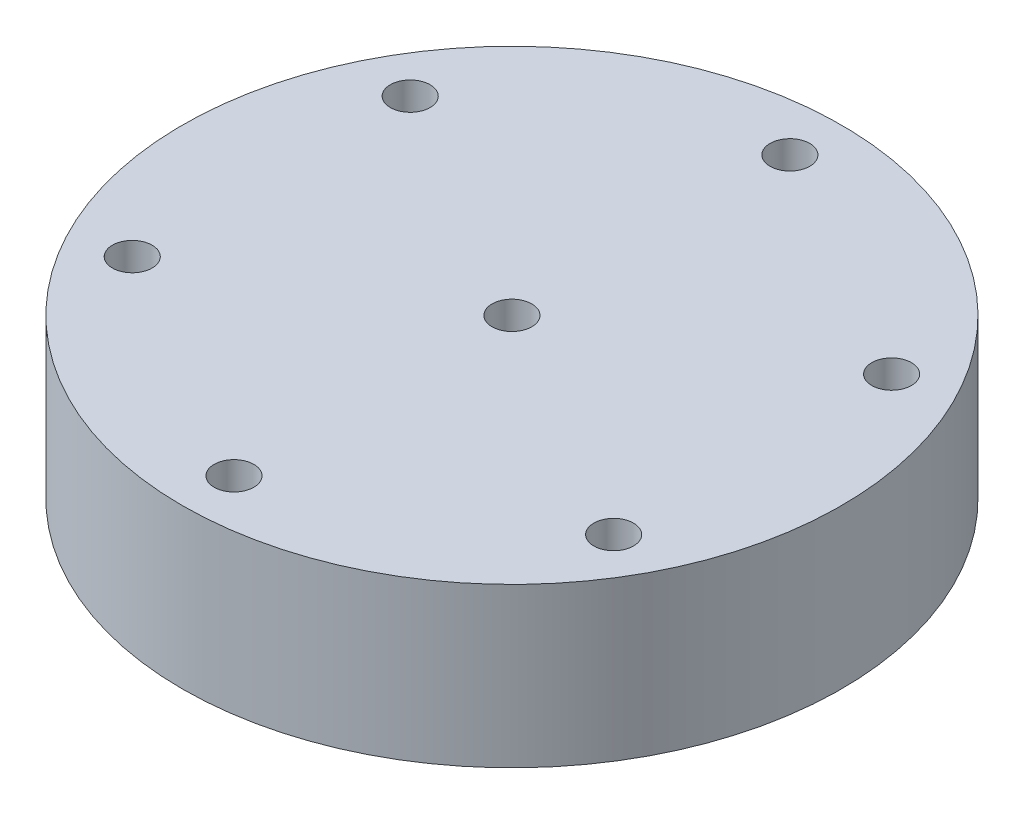
ISO-10303-21;
HEADER;
FILE_DESCRIPTION(('STEP AP214'),'2;1');
FILE_NAME('part.step','',(''),(''),'','','');
FILE_SCHEMA(('AUTOMOTIVE_DESIGN { 1 0 10303 214 1 1 1 1 }'));
ENDSEC;
DATA;
#1=APPLICATION_CONTEXT('core data for automotive mechanical design processes');
#2=APPLICATION_PROTOCOL_DEFINITION('international standard','automotive_design',2000,#1);
#3=PRODUCT_CONTEXT('',#1,'mechanical');
#4=PRODUCT('Part','Part','',(#3));
#5=PRODUCT_RELATED_PRODUCT_CATEGORY('part','',(#4));
#6=PRODUCT_DEFINITION_FORMATION('','',#4);
#7=PRODUCT_DEFINITION_CONTEXT('part definition',#1,'design');
#8=PRODUCT_DEFINITION('design','',#6,#7);
#9=PRODUCT_DEFINITION_SHAPE('','',#8);
#10=(LENGTH_UNIT() NAMED_UNIT(*) SI_UNIT(.MILLI.,.METRE.));
#11=(NAMED_UNIT(*) PLANE_ANGLE_UNIT() SI_UNIT($,.RADIAN.));
#12=(NAMED_UNIT(*) SI_UNIT($,.STERADIAN.) SOLID_ANGLE_UNIT());
#13=UNCERTAINTY_MEASURE_WITH_UNIT(LENGTH_MEASURE(1.E-05),#10,'distance_accuracy_value','');
#14=(GEOMETRIC_REPRESENTATION_CONTEXT(3) GLOBAL_UNCERTAINTY_ASSIGNED_CONTEXT((#13)) GLOBAL_UNIT_ASSIGNED_CONTEXT((#10,
#11,#12)) REPRESENTATION_CONTEXT('',''));
#15=CARTESIAN_POINT('',(0.,0.,0.));
#16=DIRECTION('',(0.,0.,1.));
#17=DIRECTION('',(1.,0.,0.));
#18=AXIS2_PLACEMENT_3D('',#15,#16,#17);
#19=CARTESIAN_POINT('',(0.,20.,0.));
#20=DIRECTION('',(0.,-1.,0.));
#21=DIRECTION('',(0.,0.,-1.));
#22=AXIS2_PLACEMENT_3D('',#19,#20,#21);
#23=CYLINDRICAL_SURFACE('',#22,41.5);
#24=CARTESIAN_POINT('',(0.,20.,0.));
#25=DIRECTION('',(0.,1.,0.));
#26=DIRECTION('',(0.,0.,1.));
#27=AXIS2_PLACEMENT_3D('',#24,#25,#26);
#28=CIRCLE('',#27,41.5);
#29=CARTESIAN_POINT('',(0.,20.,41.5));
#30=VERTEX_POINT('',#29);
#31=EDGE_CURVE('E12',#30,#30,#28,.T.);
#32=ORIENTED_EDGE('',*,*,#31,.F.);
#33=EDGE_LOOP('',(#32));
#34=FACE_BOUND('',#33,.T.);
#35=CARTESIAN_POINT('',(0.,0.,0.));
#36=DIRECTION('',(0.,1.,0.));
#37=DIRECTION('',(0.,0.,1.));
#38=AXIS2_PLACEMENT_3D('',#35,#36,#37);
#39=CIRCLE('',#38,41.5);
#40=CARTESIAN_POINT('',(0.,0.,41.5));
#41=VERTEX_POINT('',#40);
#42=EDGE_CURVE('E42',#41,#41,#39,.T.);
#43=ORIENTED_EDGE('',*,*,#42,.T.);
#44=EDGE_LOOP('',(#43));
#45=FACE_BOUND('',#44,.T.);
#46=ADVANCED_FACE('F34',(#34,#45),#23,.T.);
#47=CARTESIAN_POINT('',(0.,20.,0.));
#48=DIRECTION('',(0.,1.,0.));
#49=DIRECTION('',(0.,0.,1.));
#50=AXIS2_PLACEMENT_3D('',#47,#48,#49);
#51=PLANE('',#50);
#52=CARTESIAN_POINT('',(0.,20.,0.));
#53=DIRECTION('',(0.,1.,0.));
#54=DIRECTION('',(0.,0.,1.));
#55=AXIS2_PLACEMENT_3D('',#52,#53,#54);
#56=CIRCLE('',#55,2.5);
#57=CARTESIAN_POINT('',(0.,20.,2.5));
#58=VERTEX_POINT('',#57);
#59=EDGE_CURVE('E393',#58,#58,#56,.T.);
#60=ORIENTED_EDGE('',*,*,#59,.F.);
#61=EDGE_LOOP('',(#60));
#62=FACE_BOUND('',#61,.T.);
#63=CARTESIAN_POINT('',(-30.3108891324546,20.,-17.4999999999987));
#64=DIRECTION('',(0.,1.,0.));
#65=DIRECTION('',(0.,0.,1.));
#66=AXIS2_PLACEMENT_3D('',#63,#64,#65);
#67=CIRCLE('',#66,2.5);
#68=CARTESIAN_POINT('',(-30.3108891324546,20.,-14.9999999999987));
#69=VERTEX_POINT('',#68);
#70=EDGE_CURVE('E156',#69,#69,#67,.T.);
#71=ORIENTED_EDGE('',*,*,#70,.F.);
#72=EDGE_LOOP('',(#71));
#73=FACE_BOUND('',#72,.T.);
#74=CARTESIAN_POINT('',(-30.3108891324531,20.,17.5000000000013));
#75=DIRECTION('',(0.,1.,0.));
#76=DIRECTION('',(0.,0.,1.));
#77=AXIS2_PLACEMENT_3D('',#74,#75,#76);
#78=CIRCLE('',#77,2.5);
#79=CARTESIAN_POINT('',(-30.3108891324531,20.,20.0000000000013));
#80=VERTEX_POINT('',#79);
#81=EDGE_CURVE('E159',#80,#80,#78,.T.);
#82=ORIENTED_EDGE('',*,*,#81,.F.);
#83=EDGE_LOOP('',(#82));
#84=FACE_BOUND('',#83,.T.);
#85=CARTESIAN_POINT('',(2.97570696259839E-12,20.,35.));
#86=DIRECTION('',(0.,1.,0.));
#87=DIRECTION('',(0.,0.,1.));
#88=AXIS2_PLACEMENT_3D('',#85,#86,#87);
#89=CIRCLE('',#88,2.5);
#90=CARTESIAN_POINT('',(2.97570696259839E-12,20.,37.5));
#91=VERTEX_POINT('',#90);
#92=EDGE_CURVE('E162',#91,#91,#89,.T.);
#93=ORIENTED_EDGE('',*,*,#92,.F.);
#94=EDGE_LOOP('',(#93));
#95=FACE_BOUND('',#94,.T.);
#96=CARTESIAN_POINT('',(30.3108891324576,20.,17.4999999999987));
#97=DIRECTION('',(0.,1.,0.));
#98=DIRECTION('',(0.,0.,1.));
#99=AXIS2_PLACEMENT_3D('',#96,#97,#98);
#100=CIRCLE('',#99,2.5);
#101=CARTESIAN_POINT('',(30.3108891324576,20.,19.9999999999987));
#102=VERTEX_POINT('',#101);
#103=EDGE_CURVE('E165',#102,#102,#100,.T.);
#104=ORIENTED_EDGE('',*,*,#103,.F.);
#105=EDGE_LOOP('',(#104));
#106=FACE_BOUND('',#105,.T.);
#107=CARTESIAN_POINT('',(30.3108891324561,20.,-17.5000000000013));
#108=DIRECTION('',(0.,1.,0.));
#109=DIRECTION('',(0.,0.,1.));
#110=AXIS2_PLACEMENT_3D('',#107,#108,#109);
#111=CIRCLE('',#110,2.5);
#112=CARTESIAN_POINT('',(30.3108891324561,20.,-15.0000000000013));
#113=VERTEX_POINT('',#112);
#114=EDGE_CURVE('E168',#113,#113,#111,.T.);
#115=ORIENTED_EDGE('',*,*,#114,.F.);
#116=EDGE_LOOP('',(#115));
#117=FACE_BOUND('',#116,.T.);
#118=CARTESIAN_POINT('',(0.,20.,-35.));
#119=DIRECTION('',(0.,1.,0.));
#120=DIRECTION('',(0.,0.,1.));
#121=AXIS2_PLACEMENT_3D('',#118,#119,#120);
#122=CIRCLE('',#121,2.5);
#123=CARTESIAN_POINT('',(0.,20.,-32.5));
#124=VERTEX_POINT('',#123);
#125=EDGE_CURVE('E171',#124,#124,#122,.T.);
#126=ORIENTED_EDGE('',*,*,#125,.F.);
#127=EDGE_LOOP('',(#126));
#128=FACE_BOUND('',#127,.T.);
#129=ORIENTED_EDGE('',*,*,#31,.T.);
#130=EDGE_LOOP('',(#129));
#131=FACE_BOUND('',#130,.T.);
#132=ADVANCED_FACE('F208',(#62,#73,#84,#95,#106,#117,#128,#131),#51,.T.);
#133=CARTESIAN_POINT('',(0.,0.,0.));
#134=DIRECTION('',(0.,1.,0.));
#135=DIRECTION('',(0.,0.,1.));
#136=AXIS2_PLACEMENT_3D('',#133,#134,#135);
#137=PLANE('',#136);
#138=DIRECTION('',(1.,0.,0.));
#139=VECTOR('',#138,1.);
#140=CARTESIAN_POINT('',(13.,0.,-13.));
#141=LINE('',#140,#139);
#142=CARTESIAN_POINT('',(-13.,0.,-13.));
#143=VERTEX_POINT('',#142);
#144=CARTESIAN_POINT('',(13.,0.,-13.));
#145=VERTEX_POINT('',#144);
#146=EDGE_CURVE('E85',#143,#145,#141,.T.);
#147=ORIENTED_EDGE('',*,*,#146,.F.);
#148=DIRECTION('',(0.,0.,-1.));
#149=VECTOR('',#148,1.);
#150=CARTESIAN_POINT('',(-13.,0.,13.));
#151=LINE('',#150,#149);
#152=CARTESIAN_POINT('',(-13.,0.,13.));
#153=VERTEX_POINT('',#152);
#154=EDGE_CURVE('E50',#153,#143,#151,.T.);
#155=ORIENTED_EDGE('',*,*,#154,.F.);
#156=DIRECTION('',(-1.,0.,0.));
#157=VECTOR('',#156,1.);
#158=CARTESIAN_POINT('',(13.,0.,13.));
#159=LINE('',#158,#157);
#160=CARTESIAN_POINT('',(13.,0.,13.));
#161=VERTEX_POINT('',#160);
#162=EDGE_CURVE('E101',#161,#153,#159,.T.);
#163=ORIENTED_EDGE('',*,*,#162,.F.);
#164=DIRECTION('',(0.,0.,1.));
#165=VECTOR('',#164,1.);
#166=CARTESIAN_POINT('',(13.,0.,13.));
#167=LINE('',#166,#165);
#168=EDGE_CURVE('E108',#145,#161,#167,.T.);
#169=ORIENTED_EDGE('',*,*,#168,.F.);
#170=EDGE_LOOP('',(#147,#155,#163,#169));
#171=FACE_BOUND('',#170,.T.);
#172=CARTESIAN_POINT('',(-30.3108891324529,0.,17.5000000000008));
#173=DIRECTION('',(0.,-1.,0.));
#174=DIRECTION('',(0.,0.,-1.));
#175=AXIS2_PLACEMENT_3D('',#172,#173,#174);
#176=CIRCLE('',#175,4.75000000000187);
#177=CARTESIAN_POINT('',(-30.3108891324529,0.,12.749999999999));
#178=VERTEX_POINT('',#177);
#179=EDGE_CURVE('E112',#178,#178,#176,.T.);
#180=ORIENTED_EDGE('',*,*,#179,.F.);
#181=EDGE_LOOP('',(#180));
#182=FACE_BOUND('',#181,.T.);
#183=CARTESIAN_POINT('',(-30.3108891324539,0.,-17.4999999999991));
#184=DIRECTION('',(0.,-1.,0.));
#185=DIRECTION('',(0.,0.,-1.));
#186=AXIS2_PLACEMENT_3D('',#183,#184,#185);
#187=CIRCLE('',#186,4.75000000000365);
#188=CARTESIAN_POINT('',(-30.3108891324539,0.,-22.2500000000028));
#189=VERTEX_POINT('',#188);
#190=EDGE_CURVE('E121',#189,#189,#187,.T.);
#191=ORIENTED_EDGE('',*,*,#190,.F.);
#192=EDGE_LOOP('',(#191));
#193=FACE_BOUND('',#192,.T.);
#194=CARTESIAN_POINT('',(9.77614774876078E-13,0.,-35.));
#195=DIRECTION('',(0.,-1.,0.));
#196=DIRECTION('',(0.,0.,-1.));
#197=AXIS2_PLACEMENT_3D('',#194,#195,#196);
#198=CIRCLE('',#197,4.75000000000401);
#199=CARTESIAN_POINT('',(9.77614774876078E-13,0.,-39.750000000004));
#200=VERTEX_POINT('',#199);
#201=EDGE_CURVE('E128',#200,#200,#198,.T.);
#202=ORIENTED_EDGE('',*,*,#201,.F.);
#203=EDGE_LOOP('',(#202));
#204=FACE_BOUND('',#203,.T.);
#205=CARTESIAN_POINT('',(30.3108891324568,0.,-17.5000000000009));
#206=DIRECTION('',(0.,-1.,0.));
#207=DIRECTION('',(0.,0.,-1.));
#208=AXIS2_PLACEMENT_3D('',#205,#206,#207);
#209=CIRCLE('',#208,4.7500000000025);
#210=CARTESIAN_POINT('',(30.3108891324568,0.,-22.2500000000034));
#211=VERTEX_POINT('',#210);
#212=EDGE_CURVE('E135',#211,#211,#209,.T.);
#213=ORIENTED_EDGE('',*,*,#212,.F.);
#214=EDGE_LOOP('',(#213));
#215=FACE_BOUND('',#214,.T.);
#216=CARTESIAN_POINT('',(30.3108891324578,0.,17.4999999999991));
#217=DIRECTION('',(0.,-1.,0.));
#218=DIRECTION('',(0.,0.,-1.));
#219=AXIS2_PLACEMENT_3D('',#216,#217,#218);
#220=CIRCLE('',#219,4.75000000000053);
#221=CARTESIAN_POINT('',(30.3108891324578,0.,12.7499999999986));
#222=VERTEX_POINT('',#221);
#223=EDGE_CURVE('E142',#222,#222,#220,.T.);
#224=ORIENTED_EDGE('',*,*,#223,.F.);
#225=EDGE_LOOP('',(#224));
#226=FACE_BOUND('',#225,.T.);
#227=CARTESIAN_POINT('',(2.97570696259839E-12,0.,35.));
#228=DIRECTION('',(0.,-1.,0.));
#229=DIRECTION('',(0.,0.,-1.));
#230=AXIS2_PLACEMENT_3D('',#227,#228,#229);
#231=CIRCLE('',#230,4.75);
#232=CARTESIAN_POINT('',(2.97570696259839E-12,0.,30.25));
#233=VERTEX_POINT('',#232);
#234=EDGE_CURVE('E149',#233,#233,#231,.T.);
#235=ORIENTED_EDGE('',*,*,#234,.F.);
#236=EDGE_LOOP('',(#235));
#237=FACE_BOUND('',#236,.T.);
#238=ORIENTED_EDGE('',*,*,#42,.F.);
#239=EDGE_LOOP('',(#238));
#240=FACE_BOUND('',#239,.T.);
#241=ADVANCED_FACE('F213',(#171,#182,#193,#204,#215,#226,#237,#240),#137,.F.);
#242=CARTESIAN_POINT('',(0.,0.,-35.));
#243=DIRECTION('',(0.,1.,0.));
#244=DIRECTION('',(0.,0.,1.));
#245=AXIS2_PLACEMENT_3D('',#242,#243,#244);
#246=CYLINDRICAL_SURFACE('',#245,2.5);
#247=CARTESIAN_POINT('',(0.,16.,-35.));
#248=DIRECTION('',(0.,1.,0.));
#249=DIRECTION('',(0.,0.,1.));
#250=AXIS2_PLACEMENT_3D('',#247,#248,#249);
#251=CIRCLE('',#250,2.5);
#252=CARTESIAN_POINT('',(0.,16.,-32.5));
#253=VERTEX_POINT('',#252);
#254=EDGE_CURVE('E134',#253,#253,#251,.F.);
#255=ORIENTED_EDGE('',*,*,#254,.T.);
#256=EDGE_LOOP('',(#255));
#257=FACE_BOUND('',#256,.T.);
#258=ORIENTED_EDGE('',*,*,#125,.T.);
#259=EDGE_LOOP('',(#258));
#260=FACE_BOUND('',#259,.T.);
#261=ADVANCED_FACE('F221',(#257,#260),#246,.F.);
#262=CARTESIAN_POINT('',(30.3108891324561,0.,-17.5000000000013));
#263=DIRECTION('',(0.,1.,0.));
#264=DIRECTION('',(0.,0.,1.));
#265=AXIS2_PLACEMENT_3D('',#262,#263,#264);
#266=CYLINDRICAL_SURFACE('',#265,2.5);
#267=CARTESIAN_POINT('',(30.3108891324561,16.,-17.5000000000013));
#268=DIRECTION('',(0.,1.,0.));
#269=DIRECTION('',(0.,0.,1.));
#270=AXIS2_PLACEMENT_3D('',#267,#268,#269);
#271=CIRCLE('',#270,2.5);
#272=CARTESIAN_POINT('',(30.3108891324561,16.,-15.0000000000013));
#273=VERTEX_POINT('',#272);
#274=EDGE_CURVE('E141',#273,#273,#271,.F.);
#275=ORIENTED_EDGE('',*,*,#274,.T.);
#276=EDGE_LOOP('',(#275));
#277=FACE_BOUND('',#276,.T.);
#278=ORIENTED_EDGE('',*,*,#114,.T.);
#279=EDGE_LOOP('',(#278));
#280=FACE_BOUND('',#279,.T.);
#281=ADVANCED_FACE('F226',(#277,#280),#266,.F.);
#282=CARTESIAN_POINT('',(30.3108891324576,0.,17.4999999999987));
#283=DIRECTION('',(0.,1.,0.));
#284=DIRECTION('',(0.,0.,1.));
#285=AXIS2_PLACEMENT_3D('',#282,#283,#284);
#286=CYLINDRICAL_SURFACE('',#285,2.5);
#287=CARTESIAN_POINT('',(30.3108891324576,16.,17.4999999999987));
#288=DIRECTION('',(0.,1.,0.));
#289=DIRECTION('',(0.,0.,1.));
#290=AXIS2_PLACEMENT_3D('',#287,#288,#289);
#291=CIRCLE('',#290,2.5);
#292=CARTESIAN_POINT('',(30.3108891324576,16.,19.9999999999987));
#293=VERTEX_POINT('',#292);
#294=EDGE_CURVE('E148',#293,#293,#291,.F.);
#295=ORIENTED_EDGE('',*,*,#294,.T.);
#296=EDGE_LOOP('',(#295));
#297=FACE_BOUND('',#296,.T.);
#298=ORIENTED_EDGE('',*,*,#103,.T.);
#299=EDGE_LOOP('',(#298));
#300=FACE_BOUND('',#299,.T.);
#301=ADVANCED_FACE('F233',(#297,#300),#286,.F.);
#302=CARTESIAN_POINT('',(2.97570696259839E-12,0.,35.));
#303=DIRECTION('',(0.,1.,0.));
#304=DIRECTION('',(0.,0.,1.));
#305=AXIS2_PLACEMENT_3D('',#302,#303,#304);
#306=CYLINDRICAL_SURFACE('',#305,2.5);
#307=CARTESIAN_POINT('',(2.97570696259839E-12,16.,35.));
#308=DIRECTION('',(0.,1.,0.));
#309=DIRECTION('',(0.,0.,1.));
#310=AXIS2_PLACEMENT_3D('',#307,#308,#309);
#311=CIRCLE('',#310,2.5);
#312=CARTESIAN_POINT('',(2.97570696259839E-12,16.,37.5));
#313=VERTEX_POINT('',#312);
#314=EDGE_CURVE('E155',#313,#313,#311,.F.);
#315=ORIENTED_EDGE('',*,*,#314,.T.);
#316=EDGE_LOOP('',(#315));
#317=FACE_BOUND('',#316,.T.);
#318=ORIENTED_EDGE('',*,*,#92,.T.);
#319=EDGE_LOOP('',(#318));
#320=FACE_BOUND('',#319,.T.);
#321=ADVANCED_FACE('F237',(#317,#320),#306,.F.);
#322=CARTESIAN_POINT('',(-30.3108891324531,0.,17.5000000000013));
#323=DIRECTION('',(0.,1.,0.));
#324=DIRECTION('',(0.,0.,1.));
#325=AXIS2_PLACEMENT_3D('',#322,#323,#324);
#326=CYLINDRICAL_SURFACE('',#325,2.5);
#327=CARTESIAN_POINT('',(-30.3108891324531,16.,17.5000000000013));
#328=DIRECTION('',(0.,1.,0.));
#329=DIRECTION('',(0.,0.,1.));
#330=AXIS2_PLACEMENT_3D('',#327,#328,#329);
#331=CIRCLE('',#330,2.5);
#332=CARTESIAN_POINT('',(-30.3108891324531,16.,20.0000000000013));
#333=VERTEX_POINT('',#332);
#334=EDGE_CURVE('E120',#333,#333,#331,.F.);
#335=ORIENTED_EDGE('',*,*,#334,.T.);
#336=EDGE_LOOP('',(#335));
#337=FACE_BOUND('',#336,.T.);
#338=ORIENTED_EDGE('',*,*,#81,.T.);
#339=EDGE_LOOP('',(#338));
#340=FACE_BOUND('',#339,.T.);
#341=ADVANCED_FACE('F188',(#337,#340),#326,.F.);
#342=CARTESIAN_POINT('',(-30.3108891324546,0.,-17.4999999999987));
#343=DIRECTION('',(0.,1.,0.));
#344=DIRECTION('',(0.,0.,1.));
#345=AXIS2_PLACEMENT_3D('',#342,#343,#344);
#346=CYLINDRICAL_SURFACE('',#345,2.5);
#347=CARTESIAN_POINT('',(-30.3108891324546,16.,-17.4999999999987));
#348=DIRECTION('',(0.,1.,0.));
#349=DIRECTION('',(0.,0.,1.));
#350=AXIS2_PLACEMENT_3D('',#347,#348,#349);
#351=CIRCLE('',#350,2.5);
#352=CARTESIAN_POINT('',(-30.3108891324546,16.,-14.9999999999987));
#353=VERTEX_POINT('',#352);
#354=EDGE_CURVE('E127',#353,#353,#351,.F.);
#355=ORIENTED_EDGE('',*,*,#354,.T.);
#356=EDGE_LOOP('',(#355));
#357=FACE_BOUND('',#356,.T.);
#358=ORIENTED_EDGE('',*,*,#70,.T.);
#359=EDGE_LOOP('',(#358));
#360=FACE_BOUND('',#359,.T.);
#361=ADVANCED_FACE('F244',(#357,#360),#346,.F.);
#362=CARTESIAN_POINT('',(0.,16.,0.));
#363=DIRECTION('',(0.,1.,0.));
#364=DIRECTION('',(0.,0.,1.));
#365=AXIS2_PLACEMENT_3D('',#362,#363,#364);
#366=PLANE('',#365);
#367=CARTESIAN_POINT('',(2.97570696259839E-12,16.,35.));
#368=DIRECTION('',(0.,1.,0.));
#369=DIRECTION('',(0.,0.,1.));
#370=AXIS2_PLACEMENT_3D('',#367,#368,#369);
#371=CIRCLE('',#370,4.75);
#372=CARTESIAN_POINT('',(2.97570696259839E-12,16.,39.75));
#373=VERTEX_POINT('',#372);
#374=EDGE_CURVE('E152',#373,#373,#371,.F.);
#375=ORIENTED_EDGE('',*,*,#374,.T.);
#376=EDGE_LOOP('',(#375));
#377=FACE_BOUND('',#376,.T.);
#378=ORIENTED_EDGE('',*,*,#314,.F.);
#379=EDGE_LOOP('',(#378));
#380=FACE_BOUND('',#379,.T.);
#381=ADVANCED_FACE('F247',(#377,#380),#366,.F.);
#382=CARTESIAN_POINT('',(2.97570696259839E-12,33.4350288425558,35.));
#383=DIRECTION('',(0.,-1.,0.));
#384=DIRECTION('',(0.,0.,-1.));
#385=AXIS2_PLACEMENT_3D('',#382,#383,#384);
#386=CYLINDRICAL_SURFACE('',#385,4.75);
#387=ORIENTED_EDGE('',*,*,#234,.T.);
#388=EDGE_LOOP('',(#387));
#389=FACE_BOUND('',#388,.T.);
#390=ORIENTED_EDGE('',*,*,#374,.F.);
#391=EDGE_LOOP('',(#390));
#392=FACE_BOUND('',#391,.T.);
#393=ADVANCED_FACE('F251',(#389,#392),#386,.F.);
#394=CARTESIAN_POINT('',(0.,16.,0.));
#395=DIRECTION('',(0.,1.,0.));
#396=DIRECTION('',(0.,0.,1.));
#397=AXIS2_PLACEMENT_3D('',#394,#395,#396);
#398=PLANE('',#397);
#399=CARTESIAN_POINT('',(30.3108891324578,16.,17.4999999999991));
#400=DIRECTION('',(0.,1.,0.));
#401=DIRECTION('',(0.,0.,1.));
#402=AXIS2_PLACEMENT_3D('',#399,#400,#401);
#403=CIRCLE('',#402,4.75000000000053);
#404=CARTESIAN_POINT('',(30.3108891324578,16.,22.2499999999997));
#405=VERTEX_POINT('',#404);
#406=EDGE_CURVE('E145',#405,#405,#403,.F.);
#407=ORIENTED_EDGE('',*,*,#406,.T.);
#408=EDGE_LOOP('',(#407));
#409=FACE_BOUND('',#408,.T.);
#410=ORIENTED_EDGE('',*,*,#294,.F.);
#411=EDGE_LOOP('',(#410));
#412=FACE_BOUND('',#411,.T.);
#413=ADVANCED_FACE('F255',(#409,#412),#398,.F.);
#414=CARTESIAN_POINT('',(30.3108891324578,33.4350288425558,17.4999999999991));
#415=DIRECTION('',(0.,-1.,0.));
#416=DIRECTION('',(0.,0.,-1.));
#417=AXIS2_PLACEMENT_3D('',#414,#415,#416);
#418=CYLINDRICAL_SURFACE('',#417,4.75000000000053);
#419=ORIENTED_EDGE('',*,*,#223,.T.);
#420=EDGE_LOOP('',(#419));
#421=FACE_BOUND('',#420,.T.);
#422=ORIENTED_EDGE('',*,*,#406,.F.);
#423=EDGE_LOOP('',(#422));
#424=FACE_BOUND('',#423,.T.);
#425=ADVANCED_FACE('F259',(#421,#424),#418,.F.);
#426=CARTESIAN_POINT('',(0.,16.,0.));
#427=DIRECTION('',(0.,1.,0.));
#428=DIRECTION('',(0.,0.,1.));
#429=AXIS2_PLACEMENT_3D('',#426,#427,#428);
#430=PLANE('',#429);
#431=CARTESIAN_POINT('',(30.3108891324568,16.,-17.5000000000009));
#432=DIRECTION('',(0.,1.,0.));
#433=DIRECTION('',(0.,0.,1.));
#434=AXIS2_PLACEMENT_3D('',#431,#432,#433);
#435=CIRCLE('',#434,4.7500000000025);
#436=CARTESIAN_POINT('',(30.3108891324568,16.,-12.7499999999984));
#437=VERTEX_POINT('',#436);
#438=EDGE_CURVE('E138',#437,#437,#435,.F.);
#439=ORIENTED_EDGE('',*,*,#438,.T.);
#440=EDGE_LOOP('',(#439));
#441=FACE_BOUND('',#440,.T.);
#442=ORIENTED_EDGE('',*,*,#274,.F.);
#443=EDGE_LOOP('',(#442));
#444=FACE_BOUND('',#443,.T.);
#445=ADVANCED_FACE('F263',(#441,#444),#430,.F.);
#446=CARTESIAN_POINT('',(30.3108891324568,33.4350288425558,-17.5000000000009));
#447=DIRECTION('',(0.,-1.,0.));
#448=DIRECTION('',(0.,0.,-1.));
#449=AXIS2_PLACEMENT_3D('',#446,#447,#448);
#450=CYLINDRICAL_SURFACE('',#449,4.7500000000025);
#451=ORIENTED_EDGE('',*,*,#212,.T.);
#452=EDGE_LOOP('',(#451));
#453=FACE_BOUND('',#452,.T.);
#454=ORIENTED_EDGE('',*,*,#438,.F.);
#455=EDGE_LOOP('',(#454));
#456=FACE_BOUND('',#455,.T.);
#457=ADVANCED_FACE('F267',(#453,#456),#450,.F.);
#458=CARTESIAN_POINT('',(0.,16.,0.));
#459=DIRECTION('',(0.,1.,0.));
#460=DIRECTION('',(0.,0.,1.));
#461=AXIS2_PLACEMENT_3D('',#458,#459,#460);
#462=PLANE('',#461);
#463=CARTESIAN_POINT('',(9.77614774876078E-13,16.,-35.));
#464=DIRECTION('',(0.,1.,0.));
#465=DIRECTION('',(0.,0.,1.));
#466=AXIS2_PLACEMENT_3D('',#463,#464,#465);
#467=CIRCLE('',#466,4.75000000000401);
#468=CARTESIAN_POINT('',(9.77614774876078E-13,16.,-30.249999999996));
#469=VERTEX_POINT('',#468);
#470=EDGE_CURVE('E131',#469,#469,#467,.F.);
#471=ORIENTED_EDGE('',*,*,#470,.T.);
#472=EDGE_LOOP('',(#471));
#473=FACE_BOUND('',#472,.T.);
#474=ORIENTED_EDGE('',*,*,#254,.F.);
#475=EDGE_LOOP('',(#474));
#476=FACE_BOUND('',#475,.T.);
#477=ADVANCED_FACE('F271',(#473,#476),#462,.F.);
#478=CARTESIAN_POINT('',(9.77614774876078E-13,33.4350288425558,-35.));
#479=DIRECTION('',(0.,-1.,0.));
#480=DIRECTION('',(0.,0.,-1.));
#481=AXIS2_PLACEMENT_3D('',#478,#479,#480);
#482=CYLINDRICAL_SURFACE('',#481,4.75000000000401);
#483=ORIENTED_EDGE('',*,*,#201,.T.);
#484=EDGE_LOOP('',(#483));
#485=FACE_BOUND('',#484,.T.);
#486=ORIENTED_EDGE('',*,*,#470,.F.);
#487=EDGE_LOOP('',(#486));
#488=FACE_BOUND('',#487,.T.);
#489=ADVANCED_FACE('F275',(#485,#488),#482,.F.);
#490=CARTESIAN_POINT('',(0.,16.,0.));
#491=DIRECTION('',(0.,1.,0.));
#492=DIRECTION('',(0.,0.,1.));
#493=AXIS2_PLACEMENT_3D('',#490,#491,#492);
#494=PLANE('',#493);
#495=CARTESIAN_POINT('',(-30.3108891324539,16.,-17.4999999999991));
#496=DIRECTION('',(0.,1.,0.));
#497=DIRECTION('',(0.,0.,1.));
#498=AXIS2_PLACEMENT_3D('',#495,#496,#497);
#499=CIRCLE('',#498,4.75000000000365);
#500=CARTESIAN_POINT('',(-30.3108891324539,16.,-12.7499999999955));
#501=VERTEX_POINT('',#500);
#502=EDGE_CURVE('E124',#501,#501,#499,.F.);
#503=ORIENTED_EDGE('',*,*,#502,.T.);
#504=EDGE_LOOP('',(#503));
#505=FACE_BOUND('',#504,.T.);
#506=ORIENTED_EDGE('',*,*,#354,.F.);
#507=EDGE_LOOP('',(#506));
#508=FACE_BOUND('',#507,.T.);
#509=ADVANCED_FACE('F204',(#505,#508),#494,.F.);
#510=CARTESIAN_POINT('',(-30.3108891324539,33.4350288425558,-17.4999999999991));
#511=DIRECTION('',(0.,-1.,0.));
#512=DIRECTION('',(0.,0.,-1.));
#513=AXIS2_PLACEMENT_3D('',#510,#511,#512);
#514=CYLINDRICAL_SURFACE('',#513,4.75000000000365);
#515=ORIENTED_EDGE('',*,*,#190,.T.);
#516=EDGE_LOOP('',(#515));
#517=FACE_BOUND('',#516,.T.);
#518=ORIENTED_EDGE('',*,*,#502,.F.);
#519=EDGE_LOOP('',(#518));
#520=FACE_BOUND('',#519,.T.);
#521=ADVANCED_FACE('F194',(#517,#520),#514,.F.);
#522=CARTESIAN_POINT('',(0.,16.,0.));
#523=DIRECTION('',(0.,1.,0.));
#524=DIRECTION('',(0.,0.,1.));
#525=AXIS2_PLACEMENT_3D('',#522,#523,#524);
#526=PLANE('',#525);
#527=CARTESIAN_POINT('',(-30.3108891324529,16.,17.5000000000008));
#528=DIRECTION('',(0.,1.,0.));
#529=DIRECTION('',(0.,0.,1.));
#530=AXIS2_PLACEMENT_3D('',#527,#528,#529);
#531=CIRCLE('',#530,4.75000000000187);
#532=CARTESIAN_POINT('',(-30.3108891324529,16.,22.2500000000027));
#533=VERTEX_POINT('',#532);
#534=EDGE_CURVE('E117',#533,#533,#531,.F.);
#535=ORIENTED_EDGE('',*,*,#534,.T.);
#536=EDGE_LOOP('',(#535));
#537=FACE_BOUND('',#536,.T.);
#538=ORIENTED_EDGE('',*,*,#334,.F.);
#539=EDGE_LOOP('',(#538));
#540=FACE_BOUND('',#539,.T.);
#541=ADVANCED_FACE('F191',(#537,#540),#526,.F.);
#542=CARTESIAN_POINT('',(-30.3108891324529,33.4350288425558,17.5000000000008));
#543=DIRECTION('',(0.,-1.,0.));
#544=DIRECTION('',(0.,0.,-1.));
#545=AXIS2_PLACEMENT_3D('',#542,#543,#544);
#546=CYLINDRICAL_SURFACE('',#545,4.75000000000187);
#547=ORIENTED_EDGE('',*,*,#179,.T.);
#548=EDGE_LOOP('',(#547));
#549=FACE_BOUND('',#548,.T.);
#550=ORIENTED_EDGE('',*,*,#534,.F.);
#551=EDGE_LOOP('',(#550));
#552=FACE_BOUND('',#551,.T.);
#553=ADVANCED_FACE('F193',(#549,#552),#546,.F.);
#554=CARTESIAN_POINT('',(-13.,15.,13.));
#555=DIRECTION('',(-1.,0.,0.));
#556=DIRECTION('',(0.,0.,1.));
#557=AXIS2_PLACEMENT_3D('',#554,#555,#556);
#558=PLANE('',#557);
#559=ORIENTED_EDGE('',*,*,#154,.T.);
#560=DIRECTION('',(0.,-1.,0.));
#561=VECTOR('',#560,1.);
#562=CARTESIAN_POINT('',(-13.,15.,-13.));
#563=LINE('',#562,#561);
#564=CARTESIAN_POINT('',(-13.,15.,-13.));
#565=VERTEX_POINT('',#564);
#566=EDGE_CURVE('E73',#565,#143,#563,.T.);
#567=ORIENTED_EDGE('',*,*,#566,.F.);
#568=DIRECTION('',(0.,0.,-1.));
#569=VECTOR('',#568,1.);
#570=CARTESIAN_POINT('',(-13.,15.,13.));
#571=LINE('',#570,#569);
#572=CARTESIAN_POINT('',(-13.,15.,13.));
#573=VERTEX_POINT('',#572);
#574=EDGE_CURVE('E99',#573,#565,#571,.T.);
#575=ORIENTED_EDGE('',*,*,#574,.F.);
#576=DIRECTION('',(0.,-1.,0.));
#577=VECTOR('',#576,1.);
#578=CARTESIAN_POINT('',(-13.,15.,13.));
#579=LINE('',#578,#577);
#580=EDGE_CURVE('E58',#573,#153,#579,.T.);
#581=ORIENTED_EDGE('',*,*,#580,.T.);
#582=EDGE_LOOP('',(#559,#567,#575,#581));
#583=FACE_BOUND('',#582,.T.);
#584=ADVANCED_FACE('F201',(#583),#558,.F.);
#585=CARTESIAN_POINT('',(13.,15.,13.));
#586=DIRECTION('',(0.,0.,1.));
#587=DIRECTION('',(1.,0.,0.));
#588=AXIS2_PLACEMENT_3D('',#585,#586,#587);
#589=PLANE('',#588);
#590=ORIENTED_EDGE('',*,*,#162,.T.);
#591=ORIENTED_EDGE('',*,*,#580,.F.);
#592=DIRECTION('',(-1.,0.,0.));
#593=VECTOR('',#592,1.);
#594=CARTESIAN_POINT('',(13.,15.,13.));
#595=LINE('',#594,#593);
#596=CARTESIAN_POINT('',(13.,15.,13.));
#597=VERTEX_POINT('',#596);
#598=EDGE_CURVE('E96',#597,#573,#595,.T.);
#599=ORIENTED_EDGE('',*,*,#598,.F.);
#600=DIRECTION('',(0.,-1.,0.));
#601=VECTOR('',#600,1.);
#602=CARTESIAN_POINT('',(13.,15.,13.));
#603=LINE('',#602,#601);
#604=EDGE_CURVE('E89',#597,#161,#603,.T.);
#605=ORIENTED_EDGE('',*,*,#604,.T.);
#606=EDGE_LOOP('',(#590,#591,#599,#605));
#607=FACE_BOUND('',#606,.T.);
#608=ADVANCED_FACE('F337',(#607),#589,.F.);
#609=CARTESIAN_POINT('',(13.,15.,13.));
#610=DIRECTION('',(1.,0.,0.));
#611=DIRECTION('',(0.,0.,-1.));
#612=AXIS2_PLACEMENT_3D('',#609,#610,#611);
#613=PLANE('',#612);
#614=ORIENTED_EDGE('',*,*,#168,.T.);
#615=ORIENTED_EDGE('',*,*,#604,.F.);
#616=DIRECTION('',(0.,0.,1.));
#617=VECTOR('',#616,1.);
#618=CARTESIAN_POINT('',(13.,15.,13.));
#619=LINE('',#618,#617);
#620=CARTESIAN_POINT('',(13.,15.,-13.));
#621=VERTEX_POINT('',#620);
#622=EDGE_CURVE('E92',#621,#597,#619,.T.);
#623=ORIENTED_EDGE('',*,*,#622,.F.);
#624=DIRECTION('',(0.,-1.,0.));
#625=VECTOR('',#624,1.);
#626=CARTESIAN_POINT('',(13.,15.,-13.));
#627=LINE('',#626,#625);
#628=EDGE_CURVE('E78',#621,#145,#627,.T.);
#629=ORIENTED_EDGE('',*,*,#628,.T.);
#630=EDGE_LOOP('',(#614,#615,#623,#629));
#631=FACE_BOUND('',#630,.T.);
#632=ADVANCED_FACE('F93',(#631),#613,.F.);
#633=CARTESIAN_POINT('',(13.,15.,-13.));
#634=DIRECTION('',(0.,0.,-1.));
#635=DIRECTION('',(-1.,0.,0.));
#636=AXIS2_PLACEMENT_3D('',#633,#634,#635);
#637=PLANE('',#636);
#638=ORIENTED_EDGE('',*,*,#146,.T.);
#639=ORIENTED_EDGE('',*,*,#628,.F.);
#640=DIRECTION('',(1.,0.,0.));
#641=VECTOR('',#640,1.);
#642=CARTESIAN_POINT('',(13.,15.,-13.));
#643=LINE('',#642,#641);
#644=EDGE_CURVE('E82',#565,#621,#643,.T.);
#645=ORIENTED_EDGE('',*,*,#644,.F.);
#646=ORIENTED_EDGE('',*,*,#566,.T.);
#647=EDGE_LOOP('',(#638,#639,#645,#646));
#648=FACE_BOUND('',#647,.T.);
#649=ADVANCED_FACE('F80',(#648),#637,.F.);
#650=CARTESIAN_POINT('',(0.,15.,0.));
#651=DIRECTION('',(0.,1.,0.));
#652=DIRECTION('',(0.,0.,1.));
#653=AXIS2_PLACEMENT_3D('',#650,#651,#652);
#654=PLANE('',#653);
#655=CARTESIAN_POINT('',(0.,15.,0.));
#656=DIRECTION('',(0.,1.,0.));
#657=DIRECTION('',(0.,0.,1.));
#658=AXIS2_PLACEMENT_3D('',#655,#656,#657);
#659=CIRCLE('',#658,2.5);
#660=CARTESIAN_POINT('',(0.,15.,2.5));
#661=VERTEX_POINT('',#660);
#662=EDGE_CURVE('E37',#661,#661,#659,.T.);
#663=ORIENTED_EDGE('',*,*,#662,.T.);
#664=EDGE_LOOP('',(#663));
#665=FACE_BOUND('',#664,.T.);
#666=ORIENTED_EDGE('',*,*,#574,.T.);
#667=ORIENTED_EDGE('',*,*,#644,.T.);
#668=ORIENTED_EDGE('',*,*,#622,.T.);
#669=ORIENTED_EDGE('',*,*,#598,.T.);
#670=EDGE_LOOP('',(#666,#667,#668,#669));
#671=FACE_BOUND('',#670,.T.);
#672=ADVANCED_FACE('F98',(#665,#671),#654,.F.);
#673=CARTESIAN_POINT('',(0.,0.,0.));
#674=DIRECTION('',(0.,1.,0.));
#675=DIRECTION('',(0.,0.,1.));
#676=AXIS2_PLACEMENT_3D('',#673,#674,#675);
#677=CYLINDRICAL_SURFACE('',#676,2.5);
#678=ORIENTED_EDGE('',*,*,#59,.T.);
#679=EDGE_LOOP('',(#678));
#680=FACE_BOUND('',#679,.T.);
#681=ORIENTED_EDGE('',*,*,#662,.F.);
#682=EDGE_LOOP('',(#681));
#683=FACE_BOUND('',#682,.T.);
#684=ADVANCED_FACE('F376',(#680,#683),#677,.F.);
#685=CLOSED_SHELL('',(#46,#132,#241,#261,#281,#301,#321,#341,#361,#381,#393,#413,#425,#445,#457,
#477,#489,#509,#521,#541,#553,#584,#608,#632,#649,#672,#684));
#686=MANIFOLD_SOLID_BREP('B2',#685);
#687=ADVANCED_BREP_SHAPE_REPRESENTATION('',(#18,#686),#14);
#688=SHAPE_DEFINITION_REPRESENTATION(#9,#687);
ENDSEC;
END-ISO-10303-21;
